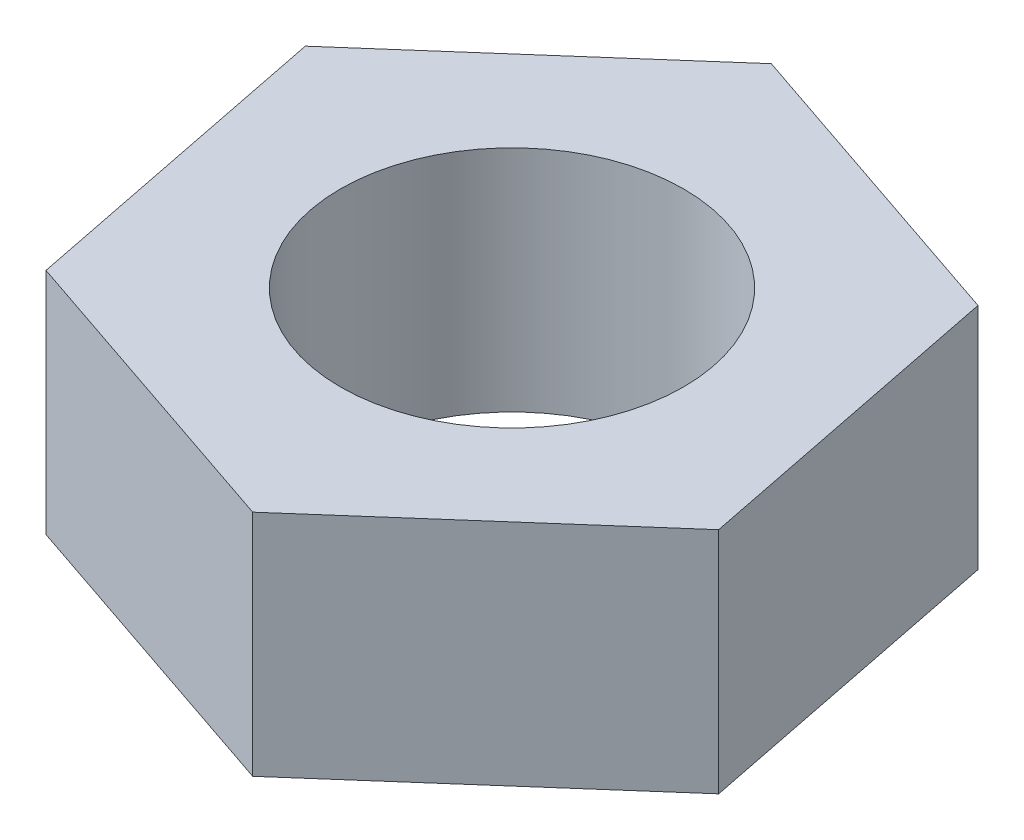
ISO-10303-21;
HEADER;
FILE_DESCRIPTION(('STEP AP214'),'2;1');
FILE_NAME('part.step','',(''),(''),'','','');
FILE_SCHEMA(('AUTOMOTIVE_DESIGN { 1 0 10303 214 1 1 1 1 }'));
ENDSEC;
DATA;
#1=APPLICATION_CONTEXT('core data for automotive mechanical design processes');
#2=APPLICATION_PROTOCOL_DEFINITION('international standard','automotive_design',2000,#1);
#3=PRODUCT_CONTEXT('',#1,'mechanical');
#4=PRODUCT('Part','Part','',(#3));
#5=PRODUCT_RELATED_PRODUCT_CATEGORY('part','',(#4));
#6=PRODUCT_DEFINITION_FORMATION('','',#4);
#7=PRODUCT_DEFINITION_CONTEXT('part definition',#1,'design');
#8=PRODUCT_DEFINITION('design','',#6,#7);
#9=PRODUCT_DEFINITION_SHAPE('','',#8);
#10=(LENGTH_UNIT() NAMED_UNIT(*) SI_UNIT(.MILLI.,.METRE.));
#11=(NAMED_UNIT(*) PLANE_ANGLE_UNIT() SI_UNIT($,.RADIAN.));
#12=(NAMED_UNIT(*) SI_UNIT($,.STERADIAN.) SOLID_ANGLE_UNIT());
#13=UNCERTAINTY_MEASURE_WITH_UNIT(LENGTH_MEASURE(1.E-05),#10,'distance_accuracy_value','');
#14=(GEOMETRIC_REPRESENTATION_CONTEXT(3) GLOBAL_UNCERTAINTY_ASSIGNED_CONTEXT((#13)) GLOBAL_UNIT_ASSIGNED_CONTEXT((#10,
#11,#12)) REPRESENTATION_CONTEXT('',''));
#15=CARTESIAN_POINT('',(0.,0.,0.));
#16=DIRECTION('',(0.,0.,1.));
#17=DIRECTION('',(1.,0.,0.));
#18=AXIS2_PLACEMENT_3D('',#15,#16,#17);
#19=CARTESIAN_POINT('',(8.24528714497441,10.,9.39495821687994));
#20=DIRECTION('',(-0.659622971597953,0.,-0.751596657350395));
#21=DIRECTION('',(-0.751596657350395,0.,0.659622971597953));
#22=AXIS2_PLACEMENT_3D('',#19,#20,#21);
#23=PLANE('',#22);
#24=DIRECTION('',(0.751596657350395,0.,-0.659622971597953));
#25=VECTOR('',#24,1.);
#26=CARTESIAN_POINT('',(8.24528714497441,0.,9.39495821687994));
#27=LINE('',#26,#25);
#28=CARTESIAN_POINT('',(2.82110548943349,0.,14.1553769695767));
#29=VERTEX_POINT('',#28);
#30=CARTESIAN_POINT('',(13.6694688005153,0.,4.6345394641832));
#31=VERTEX_POINT('',#30);
#32=EDGE_CURVE('E135',#29,#31,#27,.T.);
#33=ORIENTED_EDGE('',*,*,#32,.T.);
#34=DIRECTION('',(0.,-1.,0.));
#35=VECTOR('',#34,1.);
#36=CARTESIAN_POINT('',(13.6694688005153,10.,4.6345394641832));
#37=LINE('',#36,#35);
#38=CARTESIAN_POINT('',(13.6694688005153,10.,4.6345394641832));
#39=VERTEX_POINT('',#38);
#40=EDGE_CURVE('E11',#39,#31,#37,.T.);
#41=ORIENTED_EDGE('',*,*,#40,.F.);
#42=DIRECTION('',(0.751596657350395,0.,-0.659622971597953));
#43=VECTOR('',#42,1.);
#44=CARTESIAN_POINT('',(8.24528714497441,10.,9.39495821687994));
#45=LINE('',#44,#43);
#46=CARTESIAN_POINT('',(2.82110548943349,10.,14.1553769695767));
#47=VERTEX_POINT('',#46);
#48=EDGE_CURVE('E168',#47,#39,#45,.T.);
#49=ORIENTED_EDGE('',*,*,#48,.F.);
#50=DIRECTION('',(0.,-1.,0.));
#51=VECTOR('',#50,1.);
#52=CARTESIAN_POINT('',(2.82110548943349,10.,14.1553769695767));
#53=LINE('',#52,#51);
#54=EDGE_CURVE('E127',#47,#29,#53,.T.);
#55=ORIENTED_EDGE('',*,*,#54,.T.);
#56=EDGE_LOOP('',(#33,#41,#49,#55));
#57=FACE_BOUND('',#56,.T.);
#58=ADVANCED_FACE('F41',(#57),#23,.F.);
#59=CARTESIAN_POINT('',(12.2589160557986,10.,-2.44314902060514));
#60=DIRECTION('',(-0.980713284463886,0.,0.195451921648411));
#61=DIRECTION('',(0.195451921648411,0.,0.980713284463886));
#62=AXIS2_PLACEMENT_3D('',#59,#60,#61);
#63=PLANE('',#62);
#64=DIRECTION('',(-0.195451921648411,0.,-0.980713284463886));
#65=VECTOR('',#64,1.);
#66=CARTESIAN_POINT('',(12.2589160557986,0.,-2.44314902060514));
#67=LINE('',#66,#65);
#68=CARTESIAN_POINT('',(10.8483633110818,0.,-9.52083750539347));
#69=VERTEX_POINT('',#68);
#70=EDGE_CURVE('E139',#31,#69,#67,.T.);
#71=ORIENTED_EDGE('',*,*,#70,.T.);
#72=DIRECTION('',(0.,-1.,0.));
#73=VECTOR('',#72,1.);
#74=CARTESIAN_POINT('',(10.8483633110818,10.,-9.52083750539347));
#75=LINE('',#74,#73);
#76=CARTESIAN_POINT('',(10.8483633110818,10.,-9.52083750539347));
#77=VERTEX_POINT('',#76);
#78=EDGE_CURVE('E51',#77,#69,#75,.T.);
#79=ORIENTED_EDGE('',*,*,#78,.F.);
#80=DIRECTION('',(-0.195451921648411,0.,-0.980713284463886));
#81=VECTOR('',#80,1.);
#82=CARTESIAN_POINT('',(12.2589160557986,10.,-2.44314902060514));
#83=LINE('',#82,#81);
#84=EDGE_CURVE('E96',#39,#77,#83,.T.);
#85=ORIENTED_EDGE('',*,*,#84,.F.);
#86=ORIENTED_EDGE('',*,*,#40,.T.);
#87=EDGE_LOOP('',(#71,#79,#85,#86));
#88=FACE_BOUND('',#87,.T.);
#89=ADVANCED_FACE('F182',(#88),#63,.F.);
#90=CARTESIAN_POINT('',(4.01362891082417,10.,-11.8381072374851));
#91=DIRECTION('',(-0.321090312865934,0.,0.947048578998806));
#92=DIRECTION('',(0.947048578998806,0.,0.321090312865934));
#93=AXIS2_PLACEMENT_3D('',#90,#91,#92);
#94=PLANE('',#93);
#95=DIRECTION('',(-0.947048578998806,0.,-0.321090312865934));
#96=VECTOR('',#95,1.);
#97=CARTESIAN_POINT('',(4.01362891082417,0.,-11.8381072374851));
#98=LINE('',#97,#96);
#99=CARTESIAN_POINT('',(-2.82110548943349,0.,-14.1553769695767));
#100=VERTEX_POINT('',#99);
#101=EDGE_CURVE('E142',#69,#100,#98,.T.);
#102=ORIENTED_EDGE('',*,*,#101,.T.);
#103=DIRECTION('',(0.,-1.,0.));
#104=VECTOR('',#103,1.);
#105=CARTESIAN_POINT('',(-2.82110548943349,10.,-14.1553769695767));
#106=LINE('',#105,#104);
#107=CARTESIAN_POINT('',(-2.82110548943349,10.,-14.1553769695767));
#108=VERTEX_POINT('',#107);
#109=EDGE_CURVE('E120',#108,#100,#106,.T.);
#110=ORIENTED_EDGE('',*,*,#109,.F.);
#111=DIRECTION('',(-0.947048578998806,0.,-0.321090312865934));
#112=VECTOR('',#111,1.);
#113=CARTESIAN_POINT('',(4.01362891082417,10.,-11.8381072374851));
#114=LINE('',#113,#112);
#115=EDGE_CURVE('E109',#77,#108,#114,.T.);
#116=ORIENTED_EDGE('',*,*,#115,.F.);
#117=ORIENTED_EDGE('',*,*,#78,.T.);
#118=EDGE_LOOP('',(#102,#110,#116,#117));
#119=FACE_BOUND('',#118,.T.);
#120=ADVANCED_FACE('F161',(#119),#94,.F.);
#121=CARTESIAN_POINT('',(-8.24528714497441,10.,-9.39495821687993));
#122=DIRECTION('',(0.659622971597953,0.,0.751596657350395));
#123=DIRECTION('',(0.751596657350395,0.,-0.659622971597953));
#124=AXIS2_PLACEMENT_3D('',#121,#122,#123);
#125=PLANE('',#124);
#126=DIRECTION('',(-0.751596657350395,0.,0.659622971597953));
#127=VECTOR('',#126,1.);
#128=CARTESIAN_POINT('',(-8.24528714497441,0.,-9.39495821687993));
#129=LINE('',#128,#127);
#130=CARTESIAN_POINT('',(-13.6694688005153,0.,-4.6345394641832));
#131=VERTEX_POINT('',#130);
#132=EDGE_CURVE('E118',#100,#131,#129,.T.);
#133=ORIENTED_EDGE('',*,*,#132,.T.);
#134=DIRECTION('',(0.,-1.,0.));
#135=VECTOR('',#134,1.);
#136=CARTESIAN_POINT('',(-13.6694688005153,10.,-4.6345394641832));
#137=LINE('',#136,#135);
#138=CARTESIAN_POINT('',(-13.6694688005153,10.,-4.6345394641832));
#139=VERTEX_POINT('',#138);
#140=EDGE_CURVE('E115',#139,#131,#137,.T.);
#141=ORIENTED_EDGE('',*,*,#140,.F.);
#142=DIRECTION('',(-0.751596657350395,0.,0.659622971597953));
#143=VECTOR('',#142,1.);
#144=CARTESIAN_POINT('',(-8.24528714497441,10.,-9.39495821687993));
#145=LINE('',#144,#143);
#146=EDGE_CURVE('E103',#108,#139,#145,.T.);
#147=ORIENTED_EDGE('',*,*,#146,.F.);
#148=ORIENTED_EDGE('',*,*,#109,.T.);
#149=EDGE_LOOP('',(#133,#141,#147,#148));
#150=FACE_BOUND('',#149,.T.);
#151=ADVANCED_FACE('F116',(#150),#125,.F.);
#152=CARTESIAN_POINT('',(-12.2589160557986,10.,2.44314902060514));
#153=DIRECTION('',(0.980713284463886,0.,-0.195451921648411));
#154=DIRECTION('',(-0.195451921648411,0.,-0.980713284463886));
#155=AXIS2_PLACEMENT_3D('',#152,#153,#154);
#156=PLANE('',#155);
#157=DIRECTION('',(0.195451921648411,0.,0.980713284463886));
#158=VECTOR('',#157,1.);
#159=CARTESIAN_POINT('',(-12.2589160557986,0.,2.44314902060514));
#160=LINE('',#159,#158);
#161=CARTESIAN_POINT('',(-10.8483633110818,0.,9.52083750539348));
#162=VERTEX_POINT('',#161);
#163=EDGE_CURVE('E82',#131,#162,#160,.T.);
#164=ORIENTED_EDGE('',*,*,#163,.T.);
#165=DIRECTION('',(0.,-1.,0.));
#166=VECTOR('',#165,1.);
#167=CARTESIAN_POINT('',(-10.8483633110818,10.,9.52083750539348));
#168=LINE('',#167,#166);
#169=CARTESIAN_POINT('',(-10.8483633110818,10.,9.52083750539348));
#170=VERTEX_POINT('',#169);
#171=EDGE_CURVE('E121',#170,#162,#168,.T.);
#172=ORIENTED_EDGE('',*,*,#171,.F.);
#173=DIRECTION('',(0.195451921648411,0.,0.980713284463886));
#174=VECTOR('',#173,1.);
#175=CARTESIAN_POINT('',(-12.2589160557986,10.,2.44314902060514));
#176=LINE('',#175,#174);
#177=EDGE_CURVE('E107',#139,#170,#176,.T.);
#178=ORIENTED_EDGE('',*,*,#177,.F.);
#179=ORIENTED_EDGE('',*,*,#140,.T.);
#180=EDGE_LOOP('',(#164,#172,#178,#179));
#181=FACE_BOUND('',#180,.T.);
#182=ADVANCED_FACE('F123',(#181),#156,.F.);
#183=CARTESIAN_POINT('',(0.,10.,0.));
#184=DIRECTION('',(0.,-1.,0.));
#185=DIRECTION('',(0.,0.,-1.));
#186=AXIS2_PLACEMENT_3D('',#183,#184,#185);
#187=CYLINDRICAL_SURFACE('',#186,7.5);
#188=CARTESIAN_POINT('',(0.,10.,0.));
#189=DIRECTION('',(0.,1.,0.));
#190=DIRECTION('',(0.,0.,1.));
#191=AXIS2_PLACEMENT_3D('',#188,#189,#190);
#192=CIRCLE('',#191,7.5);
#193=CARTESIAN_POINT('',(0.,10.,7.5));
#194=VERTEX_POINT('',#193);
#195=EDGE_CURVE('E151',#194,#194,#192,.T.);
#196=ORIENTED_EDGE('',*,*,#195,.T.);
#197=EDGE_LOOP('',(#196));
#198=FACE_BOUND('',#197,.T.);
#199=CARTESIAN_POINT('',(0.,0.,0.));
#200=DIRECTION('',(0.,1.,0.));
#201=DIRECTION('',(0.,0.,1.));
#202=AXIS2_PLACEMENT_3D('',#199,#200,#201);
#203=CIRCLE('',#202,7.5);
#204=CARTESIAN_POINT('',(0.,0.,7.5));
#205=VERTEX_POINT('',#204);
#206=EDGE_CURVE('E131',#205,#205,#203,.T.);
#207=ORIENTED_EDGE('',*,*,#206,.F.);
#208=EDGE_LOOP('',(#207));
#209=FACE_BOUND('',#208,.T.);
#210=ADVANCED_FACE('F43',(#198,#209),#187,.F.);
#211=CARTESIAN_POINT('',(-4.01362891082417,10.,11.8381072374851));
#212=DIRECTION('',(0.321090312865934,0.,-0.947048578998806));
#213=DIRECTION('',(-0.947048578998806,0.,-0.321090312865934));
#214=AXIS2_PLACEMENT_3D('',#211,#212,#213);
#215=PLANE('',#214);
#216=DIRECTION('',(0.947048578998806,0.,0.321090312865934));
#217=VECTOR('',#216,1.);
#218=CARTESIAN_POINT('',(-4.01362891082417,0.,11.8381072374851));
#219=LINE('',#218,#217);
#220=EDGE_CURVE('E88',#162,#29,#219,.T.);
#221=ORIENTED_EDGE('',*,*,#220,.T.);
#222=ORIENTED_EDGE('',*,*,#54,.F.);
#223=DIRECTION('',(0.947048578998806,0.,0.321090312865934));
#224=VECTOR('',#223,1.);
#225=CARTESIAN_POINT('',(-4.01362891082417,10.,11.8381072374851));
#226=LINE('',#225,#224);
#227=EDGE_CURVE('E59',#170,#47,#226,.T.);
#228=ORIENTED_EDGE('',*,*,#227,.F.);
#229=ORIENTED_EDGE('',*,*,#171,.T.);
#230=EDGE_LOOP('',(#221,#222,#228,#229));
#231=FACE_BOUND('',#230,.T.);
#232=ADVANCED_FACE('F169',(#231),#215,.F.);
#233=CARTESIAN_POINT('',(0.,10.,0.));
#234=DIRECTION('',(0.,1.,0.));
#235=DIRECTION('',(0.,0.,1.));
#236=AXIS2_PLACEMENT_3D('',#233,#234,#235);
#237=PLANE('',#236);
#238=ORIENTED_EDGE('',*,*,#195,.F.);
#239=EDGE_LOOP('',(#238));
#240=FACE_BOUND('',#239,.T.);
#241=ORIENTED_EDGE('',*,*,#48,.T.);
#242=ORIENTED_EDGE('',*,*,#84,.T.);
#243=ORIENTED_EDGE('',*,*,#115,.T.);
#244=ORIENTED_EDGE('',*,*,#146,.T.);
#245=ORIENTED_EDGE('',*,*,#177,.T.);
#246=ORIENTED_EDGE('',*,*,#227,.T.);
#247=EDGE_LOOP('',(#241,#242,#243,#244,#245,#246));
#248=FACE_BOUND('',#247,.T.);
#249=ADVANCED_FACE('F105',(#240,#248),#237,.T.);
#250=CARTESIAN_POINT('',(0.,0.,0.));
#251=DIRECTION('',(0.,1.,0.));
#252=DIRECTION('',(0.,0.,1.));
#253=AXIS2_PLACEMENT_3D('',#250,#251,#252);
#254=PLANE('',#253);
#255=ORIENTED_EDGE('',*,*,#206,.T.);
#256=EDGE_LOOP('',(#255));
#257=FACE_BOUND('',#256,.T.);
#258=ORIENTED_EDGE('',*,*,#32,.F.);
#259=ORIENTED_EDGE('',*,*,#220,.F.);
#260=ORIENTED_EDGE('',*,*,#163,.F.);
#261=ORIENTED_EDGE('',*,*,#132,.F.);
#262=ORIENTED_EDGE('',*,*,#101,.F.);
#263=ORIENTED_EDGE('',*,*,#70,.F.);
#264=EDGE_LOOP('',(#258,#259,#260,#261,#262,#263));
#265=FACE_BOUND('',#264,.T.);
#266=ADVANCED_FACE('F164',(#257,#265),#254,.F.);
#267=CLOSED_SHELL('',(#58,#89,#120,#151,#182,#210,#232,#249,#266));
#268=MANIFOLD_SOLID_BREP('B2',#267);
#269=ADVANCED_BREP_SHAPE_REPRESENTATION('',(#18,#268),#14);
#270=SHAPE_DEFINITION_REPRESENTATION(#9,#269);
ENDSEC;
END-ISO-10303-21;
